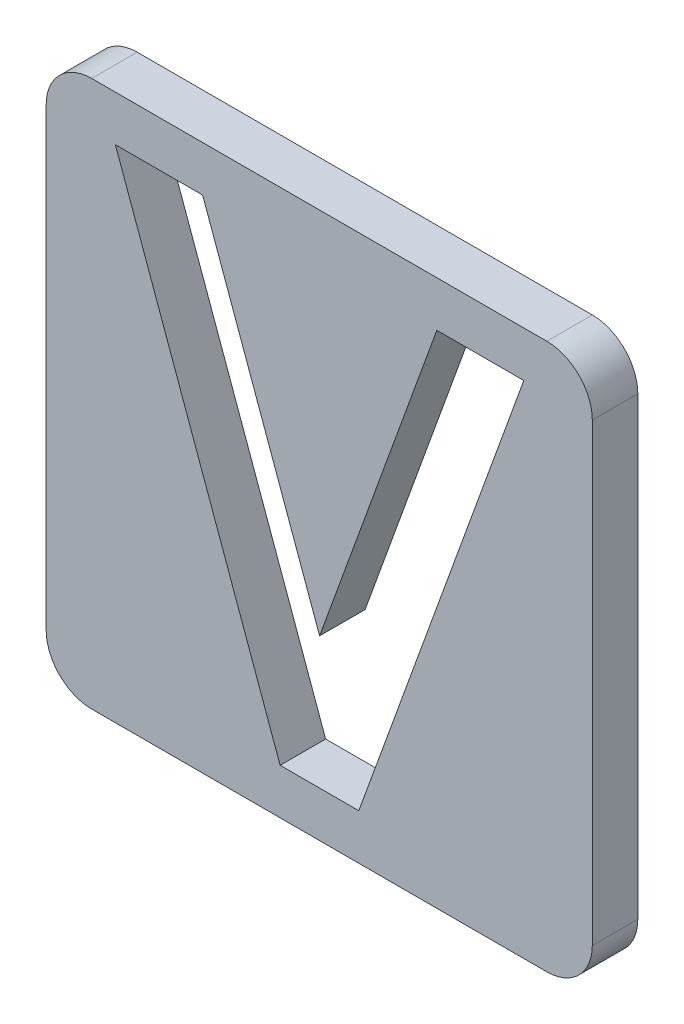
ISO-10303-21;
HEADER;
FILE_DESCRIPTION(('STEP AP214'),'2;1');
FILE_NAME('part.step','',(''),(''),'','','');
FILE_SCHEMA(('AUTOMOTIVE_DESIGN { 1 0 10303 214 1 1 1 1 }'));
ENDSEC;
DATA;
#1=APPLICATION_CONTEXT('core data for automotive mechanical design processes');
#2=APPLICATION_PROTOCOL_DEFINITION('international standard','automotive_design',2000,#1);
#3=PRODUCT_CONTEXT('',#1,'mechanical');
#4=PRODUCT('Part','Part','',(#3));
#5=PRODUCT_RELATED_PRODUCT_CATEGORY('part','',(#4));
#6=PRODUCT_DEFINITION_FORMATION('','',#4);
#7=PRODUCT_DEFINITION_CONTEXT('part definition',#1,'design');
#8=PRODUCT_DEFINITION('design','',#6,#7);
#9=PRODUCT_DEFINITION_SHAPE('','',#8);
#10=(LENGTH_UNIT() NAMED_UNIT(*) SI_UNIT(.MILLI.,.METRE.));
#11=(NAMED_UNIT(*) PLANE_ANGLE_UNIT() SI_UNIT($,.RADIAN.));
#12=(NAMED_UNIT(*) SI_UNIT($,.STERADIAN.) SOLID_ANGLE_UNIT());
#13=UNCERTAINTY_MEASURE_WITH_UNIT(LENGTH_MEASURE(1.E-05),#10,'distance_accuracy_value','');
#14=(GEOMETRIC_REPRESENTATION_CONTEXT(3) GLOBAL_UNCERTAINTY_ASSIGNED_CONTEXT((#13)) GLOBAL_UNIT_ASSIGNED_CONTEXT((#10,
#11,#12)) REPRESENTATION_CONTEXT('',''));
#15=CARTESIAN_POINT('',(0.,0.,0.));
#16=DIRECTION('',(0.,0.,1.));
#17=DIRECTION('',(1.,0.,0.));
#18=AXIS2_PLACEMENT_3D('',#15,#16,#17);
#19=CARTESIAN_POINT('',(50.,50.,10.));
#20=DIRECTION('',(0.,0.,-1.));
#21=DIRECTION('',(-1.,0.,0.));
#22=AXIS2_PLACEMENT_3D('',#19,#20,#21);
#23=PLANE('',#22);
#24=DIRECTION('',(1.,0.,0.));
#25=VECTOR('',#24,1.);
#26=CARTESIAN_POINT('',(-49.9999999999999,60.,10.));
#27=LINE('',#26,#25);
#28=CARTESIAN_POINT('',(-49.9999999999999,60.,10.));
#29=VERTEX_POINT('',#28);
#30=CARTESIAN_POINT('',(49.9999999999999,60.,10.));
#31=VERTEX_POINT('',#30);
#32=EDGE_CURVE('E200',#29,#31,#27,.T.);
#33=ORIENTED_EDGE('',*,*,#32,.F.);
#34=CARTESIAN_POINT('',(-50.,50.,10.));
#35=DIRECTION('',(0.,0.,1.));
#36=DIRECTION('',(1.,0.,0.));
#37=AXIS2_PLACEMENT_3D('',#34,#35,#36);
#38=CIRCLE('',#37,10.);
#39=CARTESIAN_POINT('',(-60.,49.9999999999999,10.));
#40=VERTEX_POINT('',#39);
#41=EDGE_CURVE('E218',#29,#40,#38,.T.);
#42=ORIENTED_EDGE('',*,*,#41,.T.);
#43=DIRECTION('',(0.,-1.,0.));
#44=VECTOR('',#43,1.);
#45=CARTESIAN_POINT('',(-60.,49.9999999999999,10.));
#46=LINE('',#45,#44);
#47=CARTESIAN_POINT('',(-60.,-49.9999999999999,10.));
#48=VERTEX_POINT('',#47);
#49=EDGE_CURVE('E216',#40,#48,#46,.T.);
#50=ORIENTED_EDGE('',*,*,#49,.T.);
#51=CARTESIAN_POINT('',(-50.,-50.,10.));
#52=DIRECTION('',(0.,0.,1.));
#53=DIRECTION('',(1.,0.,0.));
#54=AXIS2_PLACEMENT_3D('',#51,#52,#53);
#55=CIRCLE('',#54,10.);
#56=CARTESIAN_POINT('',(-49.9999999999999,-60.,10.));
#57=VERTEX_POINT('',#56);
#58=EDGE_CURVE('E214',#48,#57,#55,.T.);
#59=ORIENTED_EDGE('',*,*,#58,.T.);
#60=DIRECTION('',(1.,0.,0.));
#61=VECTOR('',#60,1.);
#62=CARTESIAN_POINT('',(-49.9999999999999,-60.,10.));
#63=LINE('',#62,#61);
#64=CARTESIAN_POINT('',(49.9999999999999,-60.,10.));
#65=VERTEX_POINT('',#64);
#66=EDGE_CURVE('E212',#57,#65,#63,.T.);
#67=ORIENTED_EDGE('',*,*,#66,.T.);
#68=CARTESIAN_POINT('',(50.,-50.,10.));
#69=DIRECTION('',(0.,0.,1.));
#70=DIRECTION('',(1.,0.,0.));
#71=AXIS2_PLACEMENT_3D('',#68,#69,#70);
#72=CIRCLE('',#71,10.);
#73=CARTESIAN_POINT('',(60.,-50.,10.));
#74=VERTEX_POINT('',#73);
#75=EDGE_CURVE('E210',#65,#74,#72,.T.);
#76=ORIENTED_EDGE('',*,*,#75,.T.);
#77=DIRECTION('',(0.,-1.,0.));
#78=VECTOR('',#77,1.);
#79=CARTESIAN_POINT('',(60.,49.9999999999999,10.));
#80=LINE('',#79,#78);
#81=CARTESIAN_POINT('',(60.,49.9999999999999,10.));
#82=VERTEX_POINT('',#81);
#83=EDGE_CURVE('E207',#82,#74,#80,.T.);
#84=ORIENTED_EDGE('',*,*,#83,.F.);
#85=CARTESIAN_POINT('',(50.,50.,10.));
#86=DIRECTION('',(0.,0.,-1.));
#87=DIRECTION('',(-1.,0.,0.));
#88=AXIS2_PLACEMENT_3D('',#85,#86,#87);
#89=CIRCLE('',#88,10.);
#90=EDGE_CURVE('E203',#31,#82,#89,.T.);
#91=ORIENTED_EDGE('',*,*,#90,.F.);
#92=EDGE_LOOP('',(#33,#42,#50,#59,#67,#76,#84,#91));
#93=FACE_BOUND('',#92,.T.);
#94=DIRECTION('',(-0.340366431597277,0.940292875779529,0.));
#95=VECTOR('',#94,1.);
#96=CARTESIAN_POINT('',(-8.59695512820513,-50.,10.));
#97=LINE('',#96,#95);
#98=CARTESIAN_POINT('',(-8.59695512820513,-50.,10.));
#99=VERTEX_POINT('',#98);
#100=CARTESIAN_POINT('',(-44.7948717948718,50.,10.));
#101=VERTEX_POINT('',#100);
#102=EDGE_CURVE('E50',#99,#101,#97,.T.);
#103=ORIENTED_EDGE('',*,*,#102,.T.);
#104=DIRECTION('',(1.,0.,0.));
#105=VECTOR('',#104,1.);
#106=CARTESIAN_POINT('',(-44.7948717948718,50.,10.));
#107=LINE('',#106,#105);
#108=CARTESIAN_POINT('',(-25.6241987179487,50.,10.));
#109=VERTEX_POINT('',#108);
#110=EDGE_CURVE('E156',#101,#109,#107,.T.);
#111=ORIENTED_EDGE('',*,*,#110,.T.);
#112=DIRECTION('',(0.340230879436886,-0.94034193178737,0.));
#113=VECTOR('',#112,1.);
#114=CARTESIAN_POINT('',(-25.6241987179487,50.,10.));
#115=LINE('',#114,#113);
#116=CARTESIAN_POINT('',(0.0769230769230786,-21.0336538461538,10.));
#117=VERTEX_POINT('',#116);
#118=EDGE_CURVE('E177',#109,#117,#115,.T.);
#119=ORIENTED_EDGE('',*,*,#118,.T.);
#120=DIRECTION('',(0.340934054581555,0.940087214266092,0.));
#121=VECTOR('',#120,1.);
#122=CARTESIAN_POINT('',(0.0769230769230786,-21.0336538461538,10.));
#123=LINE('',#122,#121);
#124=CARTESIAN_POINT('',(25.838141025641,50.,10.));
#125=VERTEX_POINT('',#124);
#126=EDGE_CURVE('E180',#117,#125,#123,.T.);
#127=ORIENTED_EDGE('',*,*,#126,.T.);
#128=DIRECTION('',(1.,0.,0.));
#129=VECTOR('',#128,1.);
#130=CARTESIAN_POINT('',(25.838141025641,50.,10.));
#131=LINE('',#130,#129);
#132=CARTESIAN_POINT('',(44.9487179487179,50.,10.));
#133=VERTEX_POINT('',#132);
#134=EDGE_CURVE('E183',#125,#133,#131,.T.);
#135=ORIENTED_EDGE('',*,*,#134,.T.);
#136=DIRECTION('',(-0.340865903167363,-0.940111927409656,0.));
#137=VECTOR('',#136,1.);
#138=CARTESIAN_POINT('',(44.9487179487179,50.,10.));
#139=LINE('',#138,#137);
#140=CARTESIAN_POINT('',(8.69070512820513,-50.,10.));
#141=VERTEX_POINT('',#140);
#142=EDGE_CURVE('E186',#133,#141,#139,.T.);
#143=ORIENTED_EDGE('',*,*,#142,.T.);
#144=DIRECTION('',(-1.,0.,0.));
#145=VECTOR('',#144,1.);
#146=CARTESIAN_POINT('',(8.69070512820513,-50.,10.));
#147=LINE('',#146,#145);
#148=EDGE_CURVE('E150',#141,#99,#147,.T.);
#149=ORIENTED_EDGE('',*,*,#148,.T.);
#150=EDGE_LOOP('',(#103,#111,#119,#127,#135,#143,#149));
#151=FACE_BOUND('',#150,.T.);
#152=ADVANCED_FACE('F33',(#93,#151),#23,.F.);
#153=CARTESIAN_POINT('',(50.,50.,0.));
#154=DIRECTION('',(0.,0.,-1.));
#155=DIRECTION('',(-1.,0.,0.));
#156=AXIS2_PLACEMENT_3D('',#153,#154,#155);
#157=PLANE('',#156);
#158=DIRECTION('',(1.,0.,0.));
#159=VECTOR('',#158,1.);
#160=CARTESIAN_POINT('',(-49.9999999999999,60.,0.));
#161=LINE('',#160,#159);
#162=CARTESIAN_POINT('',(-49.9999999999999,60.,0.));
#163=VERTEX_POINT('',#162);
#164=CARTESIAN_POINT('',(49.9999999999999,60.,0.));
#165=VERTEX_POINT('',#164);
#166=EDGE_CURVE('E157',#163,#165,#161,.T.);
#167=ORIENTED_EDGE('',*,*,#166,.T.);
#168=CARTESIAN_POINT('',(50.,50.,0.));
#169=DIRECTION('',(0.,0.,-1.));
#170=DIRECTION('',(-1.,0.,0.));
#171=AXIS2_PLACEMENT_3D('',#168,#169,#170);
#172=CIRCLE('',#171,10.);
#173=CARTESIAN_POINT('',(60.,49.9999999999999,0.));
#174=VERTEX_POINT('',#173);
#175=EDGE_CURVE('E222',#165,#174,#172,.T.);
#176=ORIENTED_EDGE('',*,*,#175,.T.);
#177=DIRECTION('',(0.,-1.,0.));
#178=VECTOR('',#177,1.);
#179=CARTESIAN_POINT('',(60.,49.9999999999999,0.));
#180=LINE('',#179,#178);
#181=CARTESIAN_POINT('',(60.,-50.,0.));
#182=VERTEX_POINT('',#181);
#183=EDGE_CURVE('E225',#174,#182,#180,.T.);
#184=ORIENTED_EDGE('',*,*,#183,.T.);
#185=CARTESIAN_POINT('',(50.,-50.,0.));
#186=DIRECTION('',(0.,0.,1.));
#187=DIRECTION('',(1.,0.,0.));
#188=AXIS2_PLACEMENT_3D('',#185,#186,#187);
#189=CIRCLE('',#188,10.);
#190=CARTESIAN_POINT('',(49.9999999999999,-60.,0.));
#191=VERTEX_POINT('',#190);
#192=EDGE_CURVE('E228',#191,#182,#189,.T.);
#193=ORIENTED_EDGE('',*,*,#192,.F.);
#194=DIRECTION('',(1.,0.,0.));
#195=VECTOR('',#194,1.);
#196=CARTESIAN_POINT('',(-49.9999999999999,-60.,0.));
#197=LINE('',#196,#195);
#198=CARTESIAN_POINT('',(-49.9999999999999,-60.,0.));
#199=VERTEX_POINT('',#198);
#200=EDGE_CURVE('E231',#199,#191,#197,.T.);
#201=ORIENTED_EDGE('',*,*,#200,.F.);
#202=CARTESIAN_POINT('',(-50.,-50.,0.));
#203=DIRECTION('',(0.,0.,1.));
#204=DIRECTION('',(1.,0.,0.));
#205=AXIS2_PLACEMENT_3D('',#202,#203,#204);
#206=CIRCLE('',#205,10.);
#207=CARTESIAN_POINT('',(-60.,-49.9999999999999,0.));
#208=VERTEX_POINT('',#207);
#209=EDGE_CURVE('E233',#208,#199,#206,.T.);
#210=ORIENTED_EDGE('',*,*,#209,.F.);
#211=DIRECTION('',(0.,-1.,0.));
#212=VECTOR('',#211,1.);
#213=CARTESIAN_POINT('',(-60.,49.9999999999999,0.));
#214=LINE('',#213,#212);
#215=CARTESIAN_POINT('',(-60.,49.9999999999999,0.));
#216=VERTEX_POINT('',#215);
#217=EDGE_CURVE('E235',#216,#208,#214,.T.);
#218=ORIENTED_EDGE('',*,*,#217,.F.);
#219=CARTESIAN_POINT('',(-50.,50.,0.));
#220=DIRECTION('',(0.,0.,1.));
#221=DIRECTION('',(1.,0.,0.));
#222=AXIS2_PLACEMENT_3D('',#219,#220,#221);
#223=CIRCLE('',#222,10.);
#224=EDGE_CURVE('E204',#163,#216,#223,.T.);
#225=ORIENTED_EDGE('',*,*,#224,.F.);
#226=EDGE_LOOP('',(#167,#176,#184,#193,#201,#210,#218,#225));
#227=FACE_BOUND('',#226,.T.);
#228=DIRECTION('',(1.,0.,0.));
#229=VECTOR('',#228,1.);
#230=CARTESIAN_POINT('',(-44.7948717948718,50.,0.));
#231=LINE('',#230,#229);
#232=CARTESIAN_POINT('',(-44.7948717948718,50.,0.));
#233=VERTEX_POINT('',#232);
#234=CARTESIAN_POINT('',(-25.6241987179487,50.,0.));
#235=VERTEX_POINT('',#234);
#236=EDGE_CURVE('E149',#233,#235,#231,.T.);
#237=ORIENTED_EDGE('',*,*,#236,.F.);
#238=DIRECTION('',(-0.340366431597277,0.940292875779529,0.));
#239=VECTOR('',#238,1.);
#240=CARTESIAN_POINT('',(-8.59695512820513,-50.,0.));
#241=LINE('',#240,#239);
#242=CARTESIAN_POINT('',(-8.59695512820513,-50.,0.));
#243=VERTEX_POINT('',#242);
#244=EDGE_CURVE('E141',#243,#233,#241,.T.);
#245=ORIENTED_EDGE('',*,*,#244,.F.);
#246=DIRECTION('',(-1.,0.,0.));
#247=VECTOR('',#246,1.);
#248=CARTESIAN_POINT('',(8.69070512820513,-50.,0.));
#249=LINE('',#248,#247);
#250=CARTESIAN_POINT('',(8.69070512820513,-50.,0.));
#251=VERTEX_POINT('',#250);
#252=EDGE_CURVE('E173',#251,#243,#249,.T.);
#253=ORIENTED_EDGE('',*,*,#252,.F.);
#254=DIRECTION('',(-0.340865903167363,-0.940111927409656,0.));
#255=VECTOR('',#254,1.);
#256=CARTESIAN_POINT('',(44.9487179487179,50.,0.));
#257=LINE('',#256,#255);
#258=CARTESIAN_POINT('',(44.9487179487179,50.,0.));
#259=VERTEX_POINT('',#258);
#260=EDGE_CURVE('E171',#259,#251,#257,.T.);
#261=ORIENTED_EDGE('',*,*,#260,.F.);
#262=DIRECTION('',(1.,0.,0.));
#263=VECTOR('',#262,1.);
#264=CARTESIAN_POINT('',(25.838141025641,50.,0.));
#265=LINE('',#264,#263);
#266=CARTESIAN_POINT('',(25.838141025641,50.,0.));
#267=VERTEX_POINT('',#266);
#268=EDGE_CURVE('E169',#267,#259,#265,.T.);
#269=ORIENTED_EDGE('',*,*,#268,.F.);
#270=DIRECTION('',(0.340934054581555,0.940087214266092,0.));
#271=VECTOR('',#270,1.);
#272=CARTESIAN_POINT('',(0.0769230769230786,-21.0336538461538,0.));
#273=LINE('',#272,#271);
#274=CARTESIAN_POINT('',(0.0769230769230786,-21.0336538461538,0.));
#275=VERTEX_POINT('',#274);
#276=EDGE_CURVE('E165',#275,#267,#273,.T.);
#277=ORIENTED_EDGE('',*,*,#276,.F.);
#278=DIRECTION('',(0.340230879436886,-0.94034193178737,0.));
#279=VECTOR('',#278,1.);
#280=CARTESIAN_POINT('',(-25.6241987179487,50.,0.));
#281=LINE('',#280,#279);
#282=EDGE_CURVE('E163',#235,#275,#281,.T.);
#283=ORIENTED_EDGE('',*,*,#282,.F.);
#284=EDGE_LOOP('',(#237,#245,#253,#261,#269,#277,#283));
#285=FACE_BOUND('',#284,.T.);
#286=ADVANCED_FACE('F161',(#227,#285),#157,.T.);
#287=CARTESIAN_POINT('',(-49.9999999999999,60.,10.));
#288=DIRECTION('',(0.,1.,0.));
#289=DIRECTION('',(0.,0.,1.));
#290=AXIS2_PLACEMENT_3D('',#287,#288,#289);
#291=PLANE('',#290);
#292=ORIENTED_EDGE('',*,*,#166,.F.);
#293=DIRECTION('',(0.,0.,-1.));
#294=VECTOR('',#293,1.);
#295=CARTESIAN_POINT('',(-49.9999999999999,60.,10.));
#296=LINE('',#295,#294);
#297=EDGE_CURVE('E11',#29,#163,#296,.T.);
#298=ORIENTED_EDGE('',*,*,#297,.F.);
#299=ORIENTED_EDGE('',*,*,#32,.T.);
#300=DIRECTION('',(0.,0.,-1.));
#301=VECTOR('',#300,1.);
#302=CARTESIAN_POINT('',(49.9999999999999,60.,10.));
#303=LINE('',#302,#301);
#304=EDGE_CURVE('E37',#31,#165,#303,.T.);
#305=ORIENTED_EDGE('',*,*,#304,.T.);
#306=EDGE_LOOP('',(#292,#298,#299,#305));
#307=FACE_BOUND('',#306,.T.);
#308=ADVANCED_FACE('F35',(#307),#291,.T.);
#309=CARTESIAN_POINT('',(-50.,50.,10.));
#310=DIRECTION('',(0.,0.,-1.));
#311=DIRECTION('',(-1.,0.,0.));
#312=AXIS2_PLACEMENT_3D('',#309,#310,#311);
#313=CYLINDRICAL_SURFACE('',#312,10.);
#314=ORIENTED_EDGE('',*,*,#224,.T.);
#315=DIRECTION('',(0.,0.,-1.));
#316=VECTOR('',#315,1.);
#317=CARTESIAN_POINT('',(-60.,49.9999999999999,10.));
#318=LINE('',#317,#316);
#319=EDGE_CURVE('E42',#40,#216,#318,.T.);
#320=ORIENTED_EDGE('',*,*,#319,.F.);
#321=ORIENTED_EDGE('',*,*,#41,.F.);
#322=ORIENTED_EDGE('',*,*,#297,.T.);
#323=EDGE_LOOP('',(#314,#320,#321,#322));
#324=FACE_BOUND('',#323,.T.);
#325=ADVANCED_FACE('F265',(#324),#313,.T.);
#326=CARTESIAN_POINT('',(-60.,49.9999999999999,10.));
#327=DIRECTION('',(1.,0.,0.));
#328=DIRECTION('',(0.,1.,0.));
#329=AXIS2_PLACEMENT_3D('',#326,#327,#328);
#330=PLANE('',#329);
#331=ORIENTED_EDGE('',*,*,#217,.T.);
#332=DIRECTION('',(0.,0.,-1.));
#333=VECTOR('',#332,1.);
#334=CARTESIAN_POINT('',(-60.,-49.9999999999999,10.));
#335=LINE('',#334,#333);
#336=EDGE_CURVE('E240',#48,#208,#335,.T.);
#337=ORIENTED_EDGE('',*,*,#336,.F.);
#338=ORIENTED_EDGE('',*,*,#49,.F.);
#339=ORIENTED_EDGE('',*,*,#319,.T.);
#340=EDGE_LOOP('',(#331,#337,#338,#339));
#341=FACE_BOUND('',#340,.T.);
#342=ADVANCED_FACE('F269',(#341),#330,.F.);
#343=CARTESIAN_POINT('',(-50.,-50.,10.));
#344=DIRECTION('',(0.,0.,-1.));
#345=DIRECTION('',(-1.,0.,0.));
#346=AXIS2_PLACEMENT_3D('',#343,#344,#345);
#347=CYLINDRICAL_SURFACE('',#346,10.);
#348=ORIENTED_EDGE('',*,*,#209,.T.);
#349=DIRECTION('',(0.,0.,-1.));
#350=VECTOR('',#349,1.);
#351=CARTESIAN_POINT('',(-49.9999999999999,-60.,10.));
#352=LINE('',#351,#350);
#353=EDGE_CURVE('E243',#57,#199,#352,.T.);
#354=ORIENTED_EDGE('',*,*,#353,.F.);
#355=ORIENTED_EDGE('',*,*,#58,.F.);
#356=ORIENTED_EDGE('',*,*,#336,.T.);
#357=EDGE_LOOP('',(#348,#354,#355,#356));
#358=FACE_BOUND('',#357,.T.);
#359=ADVANCED_FACE('F289',(#358),#347,.T.);
#360=CARTESIAN_POINT('',(-49.9999999999999,-60.,10.));
#361=DIRECTION('',(0.,1.,0.));
#362=DIRECTION('',(0.,0.,1.));
#363=AXIS2_PLACEMENT_3D('',#360,#361,#362);
#364=PLANE('',#363);
#365=ORIENTED_EDGE('',*,*,#200,.T.);
#366=DIRECTION('',(0.,0.,-1.));
#367=VECTOR('',#366,1.);
#368=CARTESIAN_POINT('',(49.9999999999999,-60.,10.));
#369=LINE('',#368,#367);
#370=EDGE_CURVE('E246',#65,#191,#369,.T.);
#371=ORIENTED_EDGE('',*,*,#370,.F.);
#372=ORIENTED_EDGE('',*,*,#66,.F.);
#373=ORIENTED_EDGE('',*,*,#353,.T.);
#374=EDGE_LOOP('',(#365,#371,#372,#373));
#375=FACE_BOUND('',#374,.T.);
#376=ADVANCED_FACE('F287',(#375),#364,.F.);
#377=CARTESIAN_POINT('',(50.,-50.,10.));
#378=DIRECTION('',(0.,0.,-1.));
#379=DIRECTION('',(-1.,0.,0.));
#380=AXIS2_PLACEMENT_3D('',#377,#378,#379);
#381=CYLINDRICAL_SURFACE('',#380,10.);
#382=ORIENTED_EDGE('',*,*,#192,.T.);
#383=DIRECTION('',(0.,0.,-1.));
#384=VECTOR('',#383,1.);
#385=CARTESIAN_POINT('',(60.,-50.,10.));
#386=LINE('',#385,#384);
#387=EDGE_CURVE('E249',#74,#182,#386,.T.);
#388=ORIENTED_EDGE('',*,*,#387,.F.);
#389=ORIENTED_EDGE('',*,*,#75,.F.);
#390=ORIENTED_EDGE('',*,*,#370,.T.);
#391=EDGE_LOOP('',(#382,#388,#389,#390));
#392=FACE_BOUND('',#391,.T.);
#393=ADVANCED_FACE('F283',(#392),#381,.T.);
#394=CARTESIAN_POINT('',(60.,49.9999999999999,10.));
#395=DIRECTION('',(1.,0.,0.));
#396=DIRECTION('',(0.,1.,0.));
#397=AXIS2_PLACEMENT_3D('',#394,#395,#396);
#398=PLANE('',#397);
#399=ORIENTED_EDGE('',*,*,#183,.F.);
#400=DIRECTION('',(0.,0.,-1.));
#401=VECTOR('',#400,1.);
#402=CARTESIAN_POINT('',(60.,49.9999999999999,10.));
#403=LINE('',#402,#401);
#404=EDGE_CURVE('E250',#82,#174,#403,.T.);
#405=ORIENTED_EDGE('',*,*,#404,.F.);
#406=ORIENTED_EDGE('',*,*,#83,.T.);
#407=ORIENTED_EDGE('',*,*,#387,.T.);
#408=EDGE_LOOP('',(#399,#405,#406,#407));
#409=FACE_BOUND('',#408,.T.);
#410=ADVANCED_FACE('F279',(#409),#398,.T.);
#411=CARTESIAN_POINT('',(50.,50.,10.));
#412=DIRECTION('',(0.,0.,-1.));
#413=DIRECTION('',(-1.,0.,0.));
#414=AXIS2_PLACEMENT_3D('',#411,#412,#413);
#415=CYLINDRICAL_SURFACE('',#414,10.);
#416=ORIENTED_EDGE('',*,*,#175,.F.);
#417=ORIENTED_EDGE('',*,*,#304,.F.);
#418=ORIENTED_EDGE('',*,*,#90,.T.);
#419=ORIENTED_EDGE('',*,*,#404,.T.);
#420=EDGE_LOOP('',(#416,#417,#418,#419));
#421=FACE_BOUND('',#420,.T.);
#422=ADVANCED_FACE('F258',(#421),#415,.T.);
#423=CARTESIAN_POINT('',(-8.59695512820513,-50.,0.));
#424=DIRECTION('',(0.940292875779529,0.340366431597277,0.));
#425=DIRECTION('',(-0.340366431597277,0.940292875779529,0.));
#426=AXIS2_PLACEMENT_3D('',#423,#424,#425);
#427=PLANE('',#426);
#428=ORIENTED_EDGE('',*,*,#102,.F.);
#429=DIRECTION('',(0.,0.,1.));
#430=VECTOR('',#429,1.);
#431=CARTESIAN_POINT('',(-8.59695512820513,-50.,0.));
#432=LINE('',#431,#430);
#433=EDGE_CURVE('E145',#243,#99,#432,.T.);
#434=ORIENTED_EDGE('',*,*,#433,.F.);
#435=ORIENTED_EDGE('',*,*,#244,.T.);
#436=DIRECTION('',(0.,0.,1.));
#437=VECTOR('',#436,1.);
#438=CARTESIAN_POINT('',(-44.7948717948718,50.,0.));
#439=LINE('',#438,#437);
#440=EDGE_CURVE('E144',#233,#101,#439,.T.);
#441=ORIENTED_EDGE('',*,*,#440,.T.);
#442=EDGE_LOOP('',(#428,#434,#435,#441));
#443=FACE_BOUND('',#442,.T.);
#444=ADVANCED_FACE('F143',(#443),#427,.T.);
#445=CARTESIAN_POINT('',(-44.7948717948718,50.,0.));
#446=DIRECTION('',(0.,-1.,0.));
#447=DIRECTION('',(0.,0.,-1.));
#448=AXIS2_PLACEMENT_3D('',#445,#446,#447);
#449=PLANE('',#448);
#450=ORIENTED_EDGE('',*,*,#110,.F.);
#451=ORIENTED_EDGE('',*,*,#440,.F.);
#452=ORIENTED_EDGE('',*,*,#236,.T.);
#453=DIRECTION('',(0.,0.,1.));
#454=VECTOR('',#453,1.);
#455=CARTESIAN_POINT('',(-25.6241987179487,50.,0.));
#456=LINE('',#455,#454);
#457=EDGE_CURVE('E158',#235,#109,#456,.T.);
#458=ORIENTED_EDGE('',*,*,#457,.T.);
#459=EDGE_LOOP('',(#450,#451,#452,#458));
#460=FACE_BOUND('',#459,.T.);
#461=ADVANCED_FACE('F153',(#460),#449,.T.);
#462=CARTESIAN_POINT('',(-25.6241987179487,50.,0.));
#463=DIRECTION('',(-0.94034193178737,-0.340230879436886,0.));
#464=DIRECTION('',(0.340230879436886,-0.94034193178737,0.));
#465=AXIS2_PLACEMENT_3D('',#462,#463,#464);
#466=PLANE('',#465);
#467=ORIENTED_EDGE('',*,*,#118,.F.);
#468=ORIENTED_EDGE('',*,*,#457,.F.);
#469=ORIENTED_EDGE('',*,*,#282,.T.);
#470=DIRECTION('',(0.,0.,1.));
#471=VECTOR('',#470,1.);
#472=CARTESIAN_POINT('',(0.0769230769230786,-21.0336538461538,0.));
#473=LINE('',#472,#471);
#474=EDGE_CURVE('E197',#275,#117,#473,.T.);
#475=ORIENTED_EDGE('',*,*,#474,.T.);
#476=EDGE_LOOP('',(#467,#468,#469,#475));
#477=FACE_BOUND('',#476,.T.);
#478=ADVANCED_FACE('F338',(#477),#466,.T.);
#479=CARTESIAN_POINT('',(0.0769230769230786,-21.0336538461538,0.));
#480=DIRECTION('',(0.940087214266092,-0.340934054581555,0.));
#481=DIRECTION('',(0.340934054581555,0.940087214266092,0.));
#482=AXIS2_PLACEMENT_3D('',#479,#480,#481);
#483=PLANE('',#482);
#484=ORIENTED_EDGE('',*,*,#126,.F.);
#485=ORIENTED_EDGE('',*,*,#474,.F.);
#486=ORIENTED_EDGE('',*,*,#276,.T.);
#487=DIRECTION('',(0.,0.,1.));
#488=VECTOR('',#487,1.);
#489=CARTESIAN_POINT('',(25.838141025641,50.,0.));
#490=LINE('',#489,#488);
#491=EDGE_CURVE('E195',#267,#125,#490,.T.);
#492=ORIENTED_EDGE('',*,*,#491,.T.);
#493=EDGE_LOOP('',(#484,#485,#486,#492));
#494=FACE_BOUND('',#493,.T.);
#495=ADVANCED_FACE('F346',(#494),#483,.T.);
#496=CARTESIAN_POINT('',(25.838141025641,50.,0.));
#497=DIRECTION('',(0.,-1.,0.));
#498=DIRECTION('',(0.,0.,-1.));
#499=AXIS2_PLACEMENT_3D('',#496,#497,#498);
#500=PLANE('',#499);
#501=ORIENTED_EDGE('',*,*,#134,.F.);
#502=ORIENTED_EDGE('',*,*,#491,.F.);
#503=ORIENTED_EDGE('',*,*,#268,.T.);
#504=DIRECTION('',(0.,0.,1.));
#505=VECTOR('',#504,1.);
#506=CARTESIAN_POINT('',(44.9487179487179,50.,0.));
#507=LINE('',#506,#505);
#508=EDGE_CURVE('E193',#259,#133,#507,.T.);
#509=ORIENTED_EDGE('',*,*,#508,.T.);
#510=EDGE_LOOP('',(#501,#502,#503,#509));
#511=FACE_BOUND('',#510,.T.);
#512=ADVANCED_FACE('F356',(#511),#500,.T.);
#513=CARTESIAN_POINT('',(44.9487179487179,50.,0.));
#514=DIRECTION('',(-0.940111927409656,0.340865903167363,0.));
#515=DIRECTION('',(-0.340865903167363,-0.940111927409656,0.));
#516=AXIS2_PLACEMENT_3D('',#513,#514,#515);
#517=PLANE('',#516);
#518=ORIENTED_EDGE('',*,*,#142,.F.);
#519=ORIENTED_EDGE('',*,*,#508,.F.);
#520=ORIENTED_EDGE('',*,*,#260,.T.);
#521=DIRECTION('',(0.,0.,1.));
#522=VECTOR('',#521,1.);
#523=CARTESIAN_POINT('',(8.69070512820513,-50.,0.));
#524=LINE('',#523,#522);
#525=EDGE_CURVE('E58',#251,#141,#524,.T.);
#526=ORIENTED_EDGE('',*,*,#525,.T.);
#527=EDGE_LOOP('',(#518,#519,#520,#526));
#528=FACE_BOUND('',#527,.T.);
#529=ADVANCED_FACE('F366',(#528),#517,.T.);
#530=CARTESIAN_POINT('',(8.69070512820513,-50.,0.));
#531=DIRECTION('',(0.,1.,0.));
#532=DIRECTION('',(0.,0.,1.));
#533=AXIS2_PLACEMENT_3D('',#530,#531,#532);
#534=PLANE('',#533);
#535=ORIENTED_EDGE('',*,*,#148,.F.);
#536=ORIENTED_EDGE('',*,*,#525,.F.);
#537=ORIENTED_EDGE('',*,*,#252,.T.);
#538=ORIENTED_EDGE('',*,*,#433,.T.);
#539=EDGE_LOOP('',(#535,#536,#537,#538));
#540=FACE_BOUND('',#539,.T.);
#541=ADVANCED_FACE('F376',(#540),#534,.T.);
#542=CLOSED_SHELL('',(#152,#286,#308,#325,#342,#359,#376,#393,#410,#422,#444,#461,#478,#495,
#512,#529,#541));
#543=MANIFOLD_SOLID_BREP('B2',#542);
#544=ADVANCED_BREP_SHAPE_REPRESENTATION('',(#18,#543),#14);
#545=SHAPE_DEFINITION_REPRESENTATION(#9,#544);
ENDSEC;
END-ISO-10303-21;
